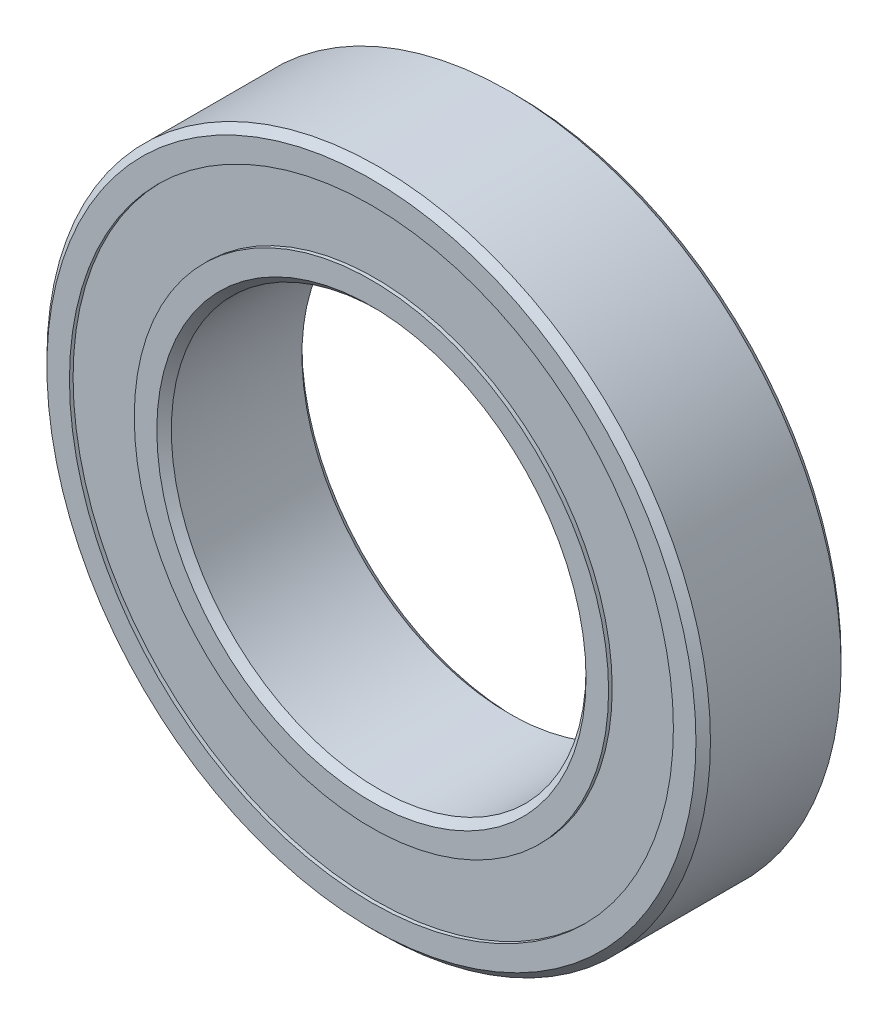
ISO-10303-21;
HEADER;
FILE_DESCRIPTION(('STEP AP214'),'2;1');
FILE_NAME('part.step','',(''),(''),'','','');
FILE_SCHEMA(('AUTOMOTIVE_DESIGN { 1 0 10303 214 1 1 1 1 }'));
ENDSEC;
DATA;
#1=APPLICATION_CONTEXT('core data for automotive mechanical design processes');
#2=APPLICATION_PROTOCOL_DEFINITION('international standard','automotive_design',2000,#1);
#3=PRODUCT_CONTEXT('',#1,'mechanical');
#4=PRODUCT('Part','Part','',(#3));
#5=PRODUCT_RELATED_PRODUCT_CATEGORY('part','',(#4));
#6=PRODUCT_DEFINITION_FORMATION('','',#4);
#7=PRODUCT_DEFINITION_CONTEXT('part definition',#1,'design');
#8=PRODUCT_DEFINITION('design','',#6,#7);
#9=PRODUCT_DEFINITION_SHAPE('','',#8);
#10=(LENGTH_UNIT() NAMED_UNIT(*) SI_UNIT(.MILLI.,.METRE.));
#11=(NAMED_UNIT(*) PLANE_ANGLE_UNIT() SI_UNIT($,.RADIAN.));
#12=(NAMED_UNIT(*) SI_UNIT($,.STERADIAN.) SOLID_ANGLE_UNIT());
#13=UNCERTAINTY_MEASURE_WITH_UNIT(LENGTH_MEASURE(1.E-05),#10,'distance_accuracy_value','');
#14=(GEOMETRIC_REPRESENTATION_CONTEXT(3) GLOBAL_UNCERTAINTY_ASSIGNED_CONTEXT((#13)) GLOBAL_UNIT_ASSIGNED_CONTEXT((#10,
#11,#12)) REPRESENTATION_CONTEXT('',''));
#15=CARTESIAN_POINT('',(0.,0.,0.));
#16=DIRECTION('',(0.,0.,1.));
#17=DIRECTION('',(1.,0.,0.));
#18=AXIS2_PLACEMENT_3D('',#15,#16,#17);
#19=CARTESIAN_POINT('',(0.,14.5625,-3.325));
#20=DIRECTION('',(0.,0.,1.));
#21=DIRECTION('',(1.,0.,0.));
#22=AXIS2_PLACEMENT_3D('',#19,#20,#21);
#23=PLANE('',#22);
#24=CARTESIAN_POINT('',(0.,0.,-3.325));
#25=DIRECTION('',(0.,0.,1.));
#26=DIRECTION('',(1.,0.,0.));
#27=AXIS2_PLACEMENT_3D('',#24,#25,#26);
#28=CIRCLE('',#27,14.5625);
#29=CARTESIAN_POINT('',(14.5625,0.,-3.325));
#30=VERTEX_POINT('',#29);
#31=EDGE_CURVE('E67',#30,#30,#28,.T.);
#32=ORIENTED_EDGE('',*,*,#31,.F.);
#33=EDGE_LOOP('',(#32));
#34=FACE_BOUND('',#33,.T.);
#35=CARTESIAN_POINT('',(0.,0.,-3.325));
#36=DIRECTION('',(0.,0.,1.));
#37=DIRECTION('',(1.,0.,0.));
#38=AXIS2_PLACEMENT_3D('',#35,#36,#37);
#39=CIRCLE('',#38,11.4375);
#40=CARTESIAN_POINT('',(11.4375,0.,-3.325));
#41=VERTEX_POINT('',#40);
#42=EDGE_CURVE('E11',#41,#41,#39,.T.);
#43=ORIENTED_EDGE('',*,*,#42,.T.);
#44=EDGE_LOOP('',(#43));
#45=FACE_BOUND('',#44,.T.);
#46=ADVANCED_FACE('F49',(#34,#45),#23,.F.);
#47=CARTESIAN_POINT('',(0.,0.,3.5));
#48=DIRECTION('',(0.,0.,1.));
#49=DIRECTION('',(1.,0.,0.));
#50=AXIS2_PLACEMENT_3D('',#47,#48,#49);
#51=CYLINDRICAL_SURFACE('',#50,11.4375);
#52=ORIENTED_EDGE('',*,*,#42,.F.);
#53=EDGE_LOOP('',(#52));
#54=FACE_BOUND('',#53,.T.);
#55=CARTESIAN_POINT('',(0.,0.,-2.20480369566539));
#56=DIRECTION('',(0.,0.,1.));
#57=DIRECTION('',(1.,0.,0.));
#58=AXIS2_PLACEMENT_3D('',#55,#56,#57);
#59=CIRCLE('',#58,11.4375);
#60=CARTESIAN_POINT('',(11.4375,0.,-2.20480369566539));
#61=VERTEX_POINT('',#60);
#62=EDGE_CURVE('E60',#61,#61,#59,.T.);
#63=ORIENTED_EDGE('',*,*,#62,.T.);
#64=EDGE_LOOP('',(#63));
#65=FACE_BOUND('',#64,.T.);
#66=ADVANCED_FACE('F78',(#54,#65),#51,.F.);
#67=CARTESIAN_POINT('',(0.,14.5625,-2.20480369566539));
#68=DIRECTION('',(0.,0.,-1.));
#69=DIRECTION('',(-1.,0.,0.));
#70=AXIS2_PLACEMENT_3D('',#67,#68,#69);
#71=PLANE('',#70);
#72=ORIENTED_EDGE('',*,*,#62,.F.);
#73=EDGE_LOOP('',(#72));
#74=FACE_BOUND('',#73,.T.);
#75=CARTESIAN_POINT('',(0.,0.,-2.20480369566539));
#76=DIRECTION('',(0.,0.,1.));
#77=DIRECTION('',(1.,0.,0.));
#78=AXIS2_PLACEMENT_3D('',#75,#76,#77);
#79=CIRCLE('',#78,14.5625);
#80=CARTESIAN_POINT('',(14.5625,0.,-2.20480369566539));
#81=VERTEX_POINT('',#80);
#82=EDGE_CURVE('E61',#81,#81,#79,.T.);
#83=ORIENTED_EDGE('',*,*,#82,.T.);
#84=EDGE_LOOP('',(#83));
#85=FACE_BOUND('',#84,.T.);
#86=ADVANCED_FACE('F84',(#74,#85),#71,.F.);
#87=CARTESIAN_POINT('',(0.,0.,3.5));
#88=DIRECTION('',(0.,0.,1.));
#89=DIRECTION('',(1.,0.,0.));
#90=AXIS2_PLACEMENT_3D('',#87,#88,#89);
#91=CYLINDRICAL_SURFACE('',#90,14.5625);
#92=ORIENTED_EDGE('',*,*,#82,.F.);
#93=EDGE_LOOP('',(#92));
#94=FACE_BOUND('',#93,.T.);
#95=ORIENTED_EDGE('',*,*,#31,.T.);
#96=EDGE_LOOP('',(#95));
#97=FACE_BOUND('',#96,.T.);
#98=ADVANCED_FACE('F79',(#94,#97),#91,.T.);
#99=CLOSED_SHELL('',(#46,#66,#86,#98));
#100=MANIFOLD_SOLID_BREP('B2',#99);
#101=CARTESIAN_POINT('',(0.,14.5625,3.325));
#102=DIRECTION('',(0.,0.,-1.));
#103=DIRECTION('',(-1.,0.,0.));
#104=AXIS2_PLACEMENT_3D('',#101,#102,#103);
#105=PLANE('',#104);
#106=CARTESIAN_POINT('',(0.,0.,3.325));
#107=DIRECTION('',(0.,0.,1.));
#108=DIRECTION('',(1.,0.,0.));
#109=AXIS2_PLACEMENT_3D('',#106,#107,#108);
#110=CIRCLE('',#109,11.4375);
#111=CARTESIAN_POINT('',(11.4375,0.,3.325));
#112=VERTEX_POINT('',#111);
#113=EDGE_CURVE('E47',#112,#112,#110,.T.);
#114=ORIENTED_EDGE('',*,*,#113,.F.);
#115=EDGE_LOOP('',(#114));
#116=FACE_BOUND('',#115,.T.);
#117=CARTESIAN_POINT('',(0.,0.,3.325));
#118=DIRECTION('',(0.,0.,1.));
#119=DIRECTION('',(1.,0.,0.));
#120=AXIS2_PLACEMENT_3D('',#117,#118,#119);
#121=CIRCLE('',#120,14.5625);
#122=CARTESIAN_POINT('',(14.5625,0.,3.325));
#123=VERTEX_POINT('',#122);
#124=EDGE_CURVE('E150',#123,#123,#121,.T.);
#125=ORIENTED_EDGE('',*,*,#124,.T.);
#126=EDGE_LOOP('',(#125));
#127=FACE_BOUND('',#126,.T.);
#128=ADVANCED_FACE('F126',(#116,#127),#105,.F.);
#129=CARTESIAN_POINT('',(0.,0.,3.5));
#130=DIRECTION('',(0.,0.,1.));
#131=DIRECTION('',(1.,0.,0.));
#132=AXIS2_PLACEMENT_3D('',#129,#130,#131);
#133=CYLINDRICAL_SURFACE('',#132,11.4375);
#134=CARTESIAN_POINT('',(0.,0.,2.20480369566539));
#135=DIRECTION('',(0.,0.,1.));
#136=DIRECTION('',(1.,0.,0.));
#137=AXIS2_PLACEMENT_3D('',#134,#135,#136);
#138=CIRCLE('',#137,11.4375);
#139=CARTESIAN_POINT('',(11.4375,0.,2.20480369566539));
#140=VERTEX_POINT('',#139);
#141=EDGE_CURVE('E133',#140,#140,#138,.T.);
#142=ORIENTED_EDGE('',*,*,#141,.F.);
#143=EDGE_LOOP('',(#142));
#144=FACE_BOUND('',#143,.T.);
#145=ORIENTED_EDGE('',*,*,#113,.T.);
#146=EDGE_LOOP('',(#145));
#147=FACE_BOUND('',#146,.T.);
#148=ADVANCED_FACE('F163',(#144,#147),#133,.F.);
#149=CARTESIAN_POINT('',(0.,14.5625,2.20480369566539));
#150=DIRECTION('',(0.,0.,1.));
#151=DIRECTION('',(1.,0.,0.));
#152=AXIS2_PLACEMENT_3D('',#149,#150,#151);
#153=PLANE('',#152);
#154=CARTESIAN_POINT('',(0.,0.,2.20480369566539));
#155=DIRECTION('',(0.,0.,1.));
#156=DIRECTION('',(1.,0.,0.));
#157=AXIS2_PLACEMENT_3D('',#154,#155,#156);
#158=CIRCLE('',#157,14.5625);
#159=CARTESIAN_POINT('',(14.5625,0.,2.20480369566539));
#160=VERTEX_POINT('',#159);
#161=EDGE_CURVE('E143',#160,#160,#158,.T.);
#162=ORIENTED_EDGE('',*,*,#161,.F.);
#163=EDGE_LOOP('',(#162));
#164=FACE_BOUND('',#163,.T.);
#165=ORIENTED_EDGE('',*,*,#141,.T.);
#166=EDGE_LOOP('',(#165));
#167=FACE_BOUND('',#166,.T.);
#168=ADVANCED_FACE('F157',(#164,#167),#153,.F.);
#169=CARTESIAN_POINT('',(0.,0.,3.5));
#170=DIRECTION('',(0.,0.,1.));
#171=DIRECTION('',(1.,0.,0.));
#172=AXIS2_PLACEMENT_3D('',#169,#170,#171);
#173=CYLINDRICAL_SURFACE('',#172,14.5625);
#174=ORIENTED_EDGE('',*,*,#124,.F.);
#175=EDGE_LOOP('',(#174));
#176=FACE_BOUND('',#175,.T.);
#177=ORIENTED_EDGE('',*,*,#161,.T.);
#178=EDGE_LOOP('',(#177));
#179=FACE_BOUND('',#178,.T.);
#180=ADVANCED_FACE('F156',(#176,#179),#173,.T.);
#181=CLOSED_SHELL('',(#128,#148,#168,#180));
#182=MANIFOLD_SOLID_BREP('B6',#181);
#183=CARTESIAN_POINT('',(-7.02833062692262,10.9362959268054,0.));
#184=DIRECTION('',(0.,0.,1.));
#185=DIRECTION('',(-0.540640817455586,0.841253532831188,0.));
#186=AXIS2_PLACEMENT_3D('',#183,#184,#185);
#187=SPHERICAL_SURFACE('',#186,2.20480369566539);
#188=CARTESIAN_POINT('',(-7.02833062692262,10.9362959268054,2.20480369566539));
#189=VERTEX_POINT('',#188);
#190=VERTEX_LOOP('',#189);
#191=FACE_BOUND('',#190,.T.);
#192=ADVANCED_FACE('F206',(#191),#187,.T.);
#193=CLOSED_SHELL('',(#192));
#194=MANIFOLD_SOLID_BREP('B42',#193);
#195=CARTESIAN_POINT('',(-11.8252159396087,5.40039516902467,0.));
#196=DIRECTION('',(0.,0.,1.));
#197=DIRECTION('',(-0.909631995354513,0.415415013001897,0.));
#198=AXIS2_PLACEMENT_3D('',#195,#196,#197);
#199=SPHERICAL_SURFACE('',#198,2.20480369566539);
#200=CARTESIAN_POINT('',(-11.8252159396087,5.40039516902467,2.20480369566539));
#201=VERTEX_POINT('',#200);
#202=VERTEX_LOOP('',#201);
#203=FACE_BOUND('',#202,.T.);
#204=ADVANCED_FACE('F223',(#203),#199,.T.);
#205=CLOSED_SHELL('',(#204));
#206=MANIFOLD_SOLID_BREP('B122',#205);
#207=CARTESIAN_POINT('',(-12.8676787444521,-1.85009289755257,0.));
#208=DIRECTION('',(0.,0.,1.));
#209=DIRECTION('',(-0.989821441880934,-0.142314838273275,0.));
#210=AXIS2_PLACEMENT_3D('',#207,#208,#209);
#211=SPHERICAL_SURFACE('',#210,2.20480369566539);
#212=CARTESIAN_POINT('',(-12.8676787444521,-1.85009289755257,2.20480369566539));
#213=VERTEX_POINT('',#212);
#214=VERTEX_LOOP('',#213);
#215=FACE_BOUND('',#214,.T.);
#216=ADVANCED_FACE('F241',(#215),#211,.T.);
#217=CLOSED_SHELL('',(#216));
#218=MANIFOLD_SOLID_BREP('B205',#217);
#219=CARTESIAN_POINT('',(-9.82474446660544,-8.51318954128862,0.));
#220=DIRECTION('',(0.,0.,1.));
#221=DIRECTION('',(-0.755749574354264,-0.654860733945278,0.));
#222=AXIS2_PLACEMENT_3D('',#219,#220,#221);
#223=SPHERICAL_SURFACE('',#222,2.20480369566539);
#224=CARTESIAN_POINT('',(-9.82474446660544,-8.51318954128862,2.20480369566539));
#225=VERTEX_POINT('',#224);
#226=VERTEX_LOOP('',#225);
#227=FACE_BOUND('',#226,.T.);
#228=ADVANCED_FACE('F263',(#227),#223,.T.);
#229=CLOSED_SHELL('',(#228));
#230=MANIFOLD_SOLID_BREP('B222',#229);
#231=CARTESIAN_POINT('',(-3.66252323893868,-12.4734086569884,0.));
#232=DIRECTION('',(0.,0.,1.));
#233=DIRECTION('',(-0.281732556841437,-0.959492973614495,0.));
#234=AXIS2_PLACEMENT_3D('',#231,#232,#233);
#235=SPHERICAL_SURFACE('',#234,2.20480369566539);
#236=CARTESIAN_POINT('',(-3.66252323893868,-12.4734086569884,2.20480369566539));
#237=VERTEX_POINT('',#236);
#238=VERTEX_LOOP('',#237);
#239=FACE_BOUND('',#238,.T.);
#240=ADVANCED_FACE('F285',(#239),#235,.T.);
#241=CLOSED_SHELL('',(#240));
#242=MANIFOLD_SOLID_BREP('B238',#241);
#243=CARTESIAN_POINT('',(3.6625232389385,-12.4734086569885,0.));
#244=DIRECTION('',(0.,0.,1.));
#245=DIRECTION('',(0.281732556841423,-0.959492973614499,0.));
#246=AXIS2_PLACEMENT_3D('',#243,#244,#245);
#247=SPHERICAL_SURFACE('',#246,2.20480369566539);
#248=CARTESIAN_POINT('',(3.6625232389385,-12.4734086569885,2.20480369566539));
#249=VERTEX_POINT('',#248);
#250=VERTEX_LOOP('',#249);
#251=FACE_BOUND('',#250,.T.);
#252=ADVANCED_FACE('F302',(#251),#247,.T.);
#253=CLOSED_SHELL('',(#252));
#254=MANIFOLD_SOLID_BREP('B259',#253);
#255=CARTESIAN_POINT('',(9.82474446660532,-8.51318954128876,0.));
#256=DIRECTION('',(0.,0.,1.));
#257=DIRECTION('',(0.755749574354255,-0.654860733945289,0.));
#258=AXIS2_PLACEMENT_3D('',#255,#256,#257);
#259=SPHERICAL_SURFACE('',#258,2.20480369566539);
#260=CARTESIAN_POINT('',(9.82474446660532,-8.51318954128876,2.20480369566539));
#261=VERTEX_POINT('',#260);
#262=VERTEX_LOOP('',#261);
#263=FACE_BOUND('',#262,.T.);
#264=ADVANCED_FACE('F319',(#263),#259,.T.);
#265=CLOSED_SHELL('',(#264));
#266=MANIFOLD_SOLID_BREP('B279',#265);
#267=CARTESIAN_POINT('',(12.8676787444521,-1.85009289755276,0.));
#268=DIRECTION('',(0.,0.,1.));
#269=DIRECTION('',(0.989821441880932,-0.142314838273289,0.));
#270=AXIS2_PLACEMENT_3D('',#267,#268,#269);
#271=SPHERICAL_SURFACE('',#270,2.20480369566539);
#272=CARTESIAN_POINT('',(12.8676787444521,-1.85009289755276,2.20480369566539));
#273=VERTEX_POINT('',#272);
#274=VERTEX_LOOP('',#273);
#275=FACE_BOUND('',#274,.T.);
#276=ADVANCED_FACE('F337',(#275),#271,.T.);
#277=CLOSED_SHELL('',(#276));
#278=MANIFOLD_SOLID_BREP('B299',#277);
#279=CARTESIAN_POINT('',(11.8252159396088,5.40039516902449,0.));
#280=DIRECTION('',(0.,0.,1.));
#281=DIRECTION('',(0.909631995354519,0.415415013001884,0.));
#282=AXIS2_PLACEMENT_3D('',#279,#280,#281);
#283=SPHERICAL_SURFACE('',#282,2.20480369566539);
#284=CARTESIAN_POINT('',(11.8252159396088,5.40039516902449,2.20480369566539));
#285=VERTEX_POINT('',#284);
#286=VERTEX_LOOP('',#285);
#287=FACE_BOUND('',#286,.T.);
#288=ADVANCED_FACE('F358',(#287),#283,.T.);
#289=CLOSED_SHELL('',(#288));
#290=MANIFOLD_SOLID_BREP('B316',#289);
#291=CARTESIAN_POINT('',(7.02833062692278,10.9362959268054,0.));
#292=DIRECTION('',(0.,0.,1.));
#293=DIRECTION('',(0.540640817455599,0.841253532831181,0.));
#294=AXIS2_PLACEMENT_3D('',#291,#292,#293);
#295=SPHERICAL_SURFACE('',#294,2.20480369566539);
#296=CARTESIAN_POINT('',(7.02833062692278,10.9362959268054,2.20480369566539));
#297=VERTEX_POINT('',#296);
#298=VERTEX_LOOP('',#297);
#299=FACE_BOUND('',#298,.T.);
#300=ADVANCED_FACE('F380',(#299),#295,.T.);
#301=CLOSED_SHELL('',(#300));
#302=MANIFOLD_SOLID_BREP('B333',#301);
#303=CARTESIAN_POINT('',(0.,13.,0.));
#304=DIRECTION('',(0.,0.,1.));
#305=DIRECTION('',(0.,1.,0.));
#306=AXIS2_PLACEMENT_3D('',#303,#304,#305);
#307=SPHERICAL_SURFACE('',#306,2.20480369566539);
#308=CARTESIAN_POINT('',(0.,13.,2.20480369566539));
#309=VERTEX_POINT('',#308);
#310=VERTEX_LOOP('',#309);
#311=FACE_BOUND('',#310,.T.);
#312=ADVANCED_FACE('F398',(#311),#307,.T.);
#313=CLOSED_SHELL('',(#312));
#314=MANIFOLD_SOLID_BREP('B351',#313);
#315=CARTESIAN_POINT('',(0.,0.,3.5));
#316=DIRECTION('',(0.,0.,1.));
#317=DIRECTION('',(1.,0.,0.));
#318=AXIS2_PLACEMENT_3D('',#315,#316,#317);
#319=CONICAL_SURFACE('',#318,10.35,0.78539816339745);
#320=CARTESIAN_POINT('',(0.,0.,3.15));
#321=DIRECTION('',(0.,0.,1.));
#322=DIRECTION('',(1.,0.,0.));
#323=AXIS2_PLACEMENT_3D('',#320,#321,#322);
#324=CIRCLE('',#323,10.);
#325=CARTESIAN_POINT('',(10.,0.,3.15));
#326=VERTEX_POINT('',#325);
#327=EDGE_CURVE('E400',#326,#326,#324,.T.);
#328=ORIENTED_EDGE('',*,*,#327,.F.);
#329=EDGE_LOOP('',(#328));
#330=FACE_BOUND('',#329,.T.);
#331=CARTESIAN_POINT('',(0.,0.,3.5));
#332=DIRECTION('',(0.,0.,1.));
#333=DIRECTION('',(1.,0.,0.));
#334=AXIS2_PLACEMENT_3D('',#331,#332,#333);
#335=CIRCLE('',#334,10.35);
#336=CARTESIAN_POINT('',(10.35,0.,3.5));
#337=VERTEX_POINT('',#336);
#338=EDGE_CURVE('E454',#337,#337,#335,.T.);
#339=ORIENTED_EDGE('',*,*,#338,.T.);
#340=EDGE_LOOP('',(#339));
#341=FACE_BOUND('',#340,.T.);
#342=ADVANCED_FACE('F416',(#330,#341),#319,.F.);
#343=CARTESIAN_POINT('',(0.,0.,3.5));
#344=DIRECTION('',(0.,0.,1.));
#345=DIRECTION('',(1.,0.,0.));
#346=AXIS2_PLACEMENT_3D('',#343,#344,#345);
#347=CYLINDRICAL_SURFACE('',#346,10.);
#348=CARTESIAN_POINT('',(0.,0.,-3.15));
#349=DIRECTION('',(0.,0.,1.));
#350=DIRECTION('',(1.,0.,0.));
#351=AXIS2_PLACEMENT_3D('',#348,#349,#350);
#352=CIRCLE('',#351,10.);
#353=CARTESIAN_POINT('',(10.,0.,-3.15));
#354=VERTEX_POINT('',#353);
#355=EDGE_CURVE('E422',#354,#354,#352,.T.);
#356=ORIENTED_EDGE('',*,*,#355,.F.);
#357=EDGE_LOOP('',(#356));
#358=FACE_BOUND('',#357,.T.);
#359=ORIENTED_EDGE('',*,*,#327,.T.);
#360=EDGE_LOOP('',(#359));
#361=FACE_BOUND('',#360,.T.);
#362=ADVANCED_FACE('F493',(#358,#361),#347,.F.);
#363=CARTESIAN_POINT('',(0.,0.,-3.15));
#364=DIRECTION('',(0.,0.,-1.));
#365=DIRECTION('',(-1.,0.,0.));
#366=AXIS2_PLACEMENT_3D('',#363,#364,#365);
#367=CONICAL_SURFACE('',#366,10.,0.785398163397451);
#368=CARTESIAN_POINT('',(0.,0.,-3.5));
#369=DIRECTION('',(0.,0.,1.));
#370=DIRECTION('',(1.,0.,0.));
#371=AXIS2_PLACEMENT_3D('',#368,#369,#370);
#372=CIRCLE('',#371,10.35);
#373=CARTESIAN_POINT('',(10.35,0.,-3.5));
#374=VERTEX_POINT('',#373);
#375=EDGE_CURVE('E431',#374,#374,#372,.T.);
#376=ORIENTED_EDGE('',*,*,#375,.F.);
#377=EDGE_LOOP('',(#376));
#378=FACE_BOUND('',#377,.T.);
#379=ORIENTED_EDGE('',*,*,#355,.T.);
#380=EDGE_LOOP('',(#379));
#381=FACE_BOUND('',#380,.T.);
#382=ADVANCED_FACE('F487',(#378,#381),#367,.F.);
#383=CARTESIAN_POINT('',(0.,10.35,-3.5));
#384=DIRECTION('',(0.,0.,1.));
#385=DIRECTION('',(1.,0.,0.));
#386=AXIS2_PLACEMENT_3D('',#383,#384,#385);
#387=PLANE('',#386);
#388=CARTESIAN_POINT('',(0.,0.,-3.5));
#389=DIRECTION('',(0.,0.,1.));
#390=DIRECTION('',(1.,0.,0.));
#391=AXIS2_PLACEMENT_3D('',#388,#389,#390);
#392=CIRCLE('',#391,11.4375);
#393=CARTESIAN_POINT('',(11.4375,0.,-3.5));
#394=VERTEX_POINT('',#393);
#395=EDGE_CURVE('E440',#394,#394,#392,.T.);
#396=ORIENTED_EDGE('',*,*,#395,.F.);
#397=EDGE_LOOP('',(#396));
#398=FACE_BOUND('',#397,.T.);
#399=ORIENTED_EDGE('',*,*,#375,.T.);
#400=EDGE_LOOP('',(#399));
#401=FACE_BOUND('',#400,.T.);
#402=ADVANCED_FACE('F483',(#398,#401),#387,.F.);
#403=CARTESIAN_POINT('',(0.,0.,3.5));
#404=DIRECTION('',(0.,0.,1.));
#405=DIRECTION('',(1.,0.,0.));
#406=AXIS2_PLACEMENT_3D('',#403,#404,#405);
#407=CYLINDRICAL_SURFACE('',#406,11.4375);
#408=CARTESIAN_POINT('',(0.,0.,-1.55555555555555));
#409=DIRECTION('',(0.,0.,1.));
#410=DIRECTION('',(1.,0.,0.));
#411=AXIS2_PLACEMENT_3D('',#408,#409,#410);
#412=CIRCLE('',#411,11.4375);
#413=CARTESIAN_POINT('',(11.4375,0.,-1.55555555555555));
#414=VERTEX_POINT('',#413);
#415=EDGE_CURVE('E444',#414,#414,#412,.T.);
#416=ORIENTED_EDGE('',*,*,#415,.F.);
#417=EDGE_LOOP('',(#416));
#418=FACE_BOUND('',#417,.T.);
#419=ORIENTED_EDGE('',*,*,#395,.T.);
#420=EDGE_LOOP('',(#419));
#421=FACE_BOUND('',#420,.T.);
#422=ADVANCED_FACE('F480',(#418,#421),#407,.T.);
#423=CARTESIAN_POINT('',(0.,0.,0.));
#424=DIRECTION('',(0.,0.,1.));
#425=DIRECTION('',(1.,0.,0.));
#426=AXIS2_PLACEMENT_3D('',#423,#424,#425);
#427=TOROIDAL_SURFACE('',#426,13.,2.20480369566539);
#428=CARTESIAN_POINT('',(0.,0.,1.55555555555556));
#429=DIRECTION('',(0.,0.,1.));
#430=DIRECTION('',(1.,0.,0.));
#431=AXIS2_PLACEMENT_3D('',#428,#429,#430);
#432=CIRCLE('',#431,11.4375);
#433=CARTESIAN_POINT('',(11.4375,0.,1.55555555555556));
#434=VERTEX_POINT('',#433);
#435=EDGE_CURVE('E450',#434,#434,#432,.T.);
#436=ORIENTED_EDGE('',*,*,#435,.F.);
#437=EDGE_LOOP('',(#436));
#438=FACE_BOUND('',#437,.T.);
#439=ORIENTED_EDGE('',*,*,#415,.T.);
#440=EDGE_LOOP('',(#439));
#441=FACE_BOUND('',#440,.T.);
#442=ADVANCED_FACE('F473',(#438,#441),#427,.F.);
#443=CARTESIAN_POINT('',(0.,0.,3.5));
#444=DIRECTION('',(0.,0.,1.));
#445=DIRECTION('',(1.,0.,0.));
#446=AXIS2_PLACEMENT_3D('',#443,#444,#445);
#447=CYLINDRICAL_SURFACE('',#446,11.4375);
#448=CARTESIAN_POINT('',(0.,0.,3.5));
#449=DIRECTION('',(0.,0.,1.));
#450=DIRECTION('',(1.,0.,0.));
#451=AXIS2_PLACEMENT_3D('',#448,#449,#450);
#452=CIRCLE('',#451,11.4375);
#453=CARTESIAN_POINT('',(11.4375,0.,3.5));
#454=VERTEX_POINT('',#453);
#455=EDGE_CURVE('E451',#454,#454,#452,.T.);
#456=ORIENTED_EDGE('',*,*,#455,.F.);
#457=EDGE_LOOP('',(#456));
#458=FACE_BOUND('',#457,.T.);
#459=ORIENTED_EDGE('',*,*,#435,.T.);
#460=EDGE_LOOP('',(#459));
#461=FACE_BOUND('',#460,.T.);
#462=ADVANCED_FACE('F463',(#458,#461),#447,.T.);
#463=CARTESIAN_POINT('',(0.,10.35,3.5));
#464=DIRECTION('',(0.,0.,-1.));
#465=DIRECTION('',(-1.,0.,0.));
#466=AXIS2_PLACEMENT_3D('',#463,#464,#465);
#467=PLANE('',#466);
#468=ORIENTED_EDGE('',*,*,#338,.F.);
#469=EDGE_LOOP('',(#468));
#470=FACE_BOUND('',#469,.T.);
#471=ORIENTED_EDGE('',*,*,#455,.T.);
#472=EDGE_LOOP('',(#471));
#473=FACE_BOUND('',#472,.T.);
#474=ADVANCED_FACE('F464',(#470,#473),#467,.F.);
#475=CLOSED_SHELL('',(#342,#362,#382,#402,#422,#442,#462,#474));
#476=MANIFOLD_SOLID_BREP('B373',#475);
#477=CARTESIAN_POINT('',(0.,0.,3.15));
#478=DIRECTION('',(0.,0.,-1.));
#479=DIRECTION('',(-1.,0.,0.));
#480=AXIS2_PLACEMENT_3D('',#477,#478,#479);
#481=CONICAL_SURFACE('',#480,16.,0.785398163397449);
#482=CARTESIAN_POINT('',(0.,0.,3.5));
#483=DIRECTION('',(0.,0.,1.));
#484=DIRECTION('',(1.,0.,0.));
#485=AXIS2_PLACEMENT_3D('',#482,#483,#484);
#486=CIRCLE('',#485,15.65);
#487=CARTESIAN_POINT('',(15.65,0.,3.5));
#488=VERTEX_POINT('',#487);
#489=EDGE_CURVE('E417',#488,#488,#486,.T.);
#490=ORIENTED_EDGE('',*,*,#489,.F.);
#491=EDGE_LOOP('',(#490));
#492=FACE_BOUND('',#491,.T.);
#493=CARTESIAN_POINT('',(0.,0.,3.15));
#494=DIRECTION('',(0.,0.,1.));
#495=DIRECTION('',(1.,0.,0.));
#496=AXIS2_PLACEMENT_3D('',#493,#494,#495);
#497=CIRCLE('',#496,16.);
#498=CARTESIAN_POINT('',(16.,0.,3.15));
#499=VERTEX_POINT('',#498);
#500=EDGE_CURVE('E593',#499,#499,#497,.T.);
#501=ORIENTED_EDGE('',*,*,#500,.T.);
#502=EDGE_LOOP('',(#501));
#503=FACE_BOUND('',#502,.T.);
#504=ADVANCED_FACE('F558',(#492,#503),#481,.T.);
#505=CARTESIAN_POINT('',(0.,15.65,3.5));
#506=DIRECTION('',(0.,0.,-1.));
#507=DIRECTION('',(-1.,0.,0.));
#508=AXIS2_PLACEMENT_3D('',#505,#506,#507);
#509=PLANE('',#508);
#510=CARTESIAN_POINT('',(0.,0.,3.5));
#511=DIRECTION('',(0.,0.,1.));
#512=DIRECTION('',(1.,0.,0.));
#513=AXIS2_PLACEMENT_3D('',#510,#511,#512);
#514=CIRCLE('',#513,14.5625);
#515=CARTESIAN_POINT('',(14.5625,0.,3.5));
#516=VERTEX_POINT('',#515);
#517=EDGE_CURVE('E563',#516,#516,#514,.T.);
#518=ORIENTED_EDGE('',*,*,#517,.F.);
#519=EDGE_LOOP('',(#518));
#520=FACE_BOUND('',#519,.T.);
#521=ORIENTED_EDGE('',*,*,#489,.T.);
#522=EDGE_LOOP('',(#521));
#523=FACE_BOUND('',#522,.T.);
#524=ADVANCED_FACE('F635',(#520,#523),#509,.F.);
#525=CARTESIAN_POINT('',(0.,0.,3.5));
#526=DIRECTION('',(0.,0.,1.));
#527=DIRECTION('',(1.,0.,0.));
#528=AXIS2_PLACEMENT_3D('',#525,#526,#527);
#529=CYLINDRICAL_SURFACE('',#528,14.5625);
#530=CARTESIAN_POINT('',(0.,0.,1.55555555555556));
#531=DIRECTION('',(0.,0.,1.));
#532=DIRECTION('',(1.,0.,0.));
#533=AXIS2_PLACEMENT_3D('',#530,#531,#532);
#534=CIRCLE('',#533,14.5625);
#535=CARTESIAN_POINT('',(14.5625,0.,1.55555555555556));
#536=VERTEX_POINT('',#535);
#537=EDGE_CURVE('E569',#536,#536,#534,.T.);
#538=ORIENTED_EDGE('',*,*,#537,.F.);
#539=EDGE_LOOP('',(#538));
#540=FACE_BOUND('',#539,.T.);
#541=ORIENTED_EDGE('',*,*,#517,.T.);
#542=EDGE_LOOP('',(#541));
#543=FACE_BOUND('',#542,.T.);
#544=ADVANCED_FACE('F629',(#540,#543),#529,.F.);
#545=CARTESIAN_POINT('',(0.,0.,0.));
#546=DIRECTION('',(0.,0.,1.));
#547=DIRECTION('',(1.,0.,0.));
#548=AXIS2_PLACEMENT_3D('',#545,#546,#547);
#549=TOROIDAL_SURFACE('',#548,13.,2.20480369566539);
#550=CARTESIAN_POINT('',(0.,0.,-1.55555555555556));
#551=DIRECTION('',(0.,0.,1.));
#552=DIRECTION('',(1.,0.,0.));
#553=AXIS2_PLACEMENT_3D('',#550,#551,#552);
#554=CIRCLE('',#553,14.5625);
#555=CARTESIAN_POINT('',(14.5625,0.,-1.55555555555556));
#556=VERTEX_POINT('',#555);
#557=EDGE_CURVE('E573',#556,#556,#554,.T.);
#558=ORIENTED_EDGE('',*,*,#557,.F.);
#559=EDGE_LOOP('',(#558));
#560=FACE_BOUND('',#559,.T.);
#561=ORIENTED_EDGE('',*,*,#537,.T.);
#562=EDGE_LOOP('',(#561));
#563=FACE_BOUND('',#562,.T.);
#564=ADVANCED_FACE('F622',(#560,#563),#549,.F.);
#565=CARTESIAN_POINT('',(0.,0.,3.5));
#566=DIRECTION('',(0.,0.,1.));
#567=DIRECTION('',(1.,0.,0.));
#568=AXIS2_PLACEMENT_3D('',#565,#566,#567);
#569=CYLINDRICAL_SURFACE('',#568,14.5625);
#570=CARTESIAN_POINT('',(0.,0.,-3.5));
#571=DIRECTION('',(0.,0.,1.));
#572=DIRECTION('',(1.,0.,0.));
#573=AXIS2_PLACEMENT_3D('',#570,#571,#572);
#574=CIRCLE('',#573,14.5625);
#575=CARTESIAN_POINT('',(14.5625,0.,-3.5));
#576=VERTEX_POINT('',#575);
#577=EDGE_CURVE('E583',#576,#576,#574,.T.);
#578=ORIENTED_EDGE('',*,*,#577,.F.);
#579=EDGE_LOOP('',(#578));
#580=FACE_BOUND('',#579,.T.);
#581=ORIENTED_EDGE('',*,*,#557,.T.);
#582=EDGE_LOOP('',(#581));
#583=FACE_BOUND('',#582,.T.);
#584=ADVANCED_FACE('F614',(#580,#583),#569,.F.);
#585=CARTESIAN_POINT('',(0.,15.65,-3.5));
#586=DIRECTION('',(0.,0.,1.));
#587=DIRECTION('',(1.,0.,0.));
#588=AXIS2_PLACEMENT_3D('',#585,#586,#587);
#589=PLANE('',#588);
#590=CARTESIAN_POINT('',(0.,0.,-3.5));
#591=DIRECTION('',(0.,0.,1.));
#592=DIRECTION('',(1.,0.,0.));
#593=AXIS2_PLACEMENT_3D('',#590,#591,#592);
#594=CIRCLE('',#593,15.65);
#595=CARTESIAN_POINT('',(15.65,0.,-3.5));
#596=VERTEX_POINT('',#595);
#597=EDGE_CURVE('E584',#596,#596,#594,.T.);
#598=ORIENTED_EDGE('',*,*,#597,.F.);
#599=EDGE_LOOP('',(#598));
#600=FACE_BOUND('',#599,.T.);
#601=ORIENTED_EDGE('',*,*,#577,.T.);
#602=EDGE_LOOP('',(#601));
#603=FACE_BOUND('',#602,.T.);
#604=ADVANCED_FACE('F606',(#600,#603),#589,.F.);
#605=CARTESIAN_POINT('',(0.,0.,-3.5));
#606=DIRECTION('',(0.,0.,1.));
#607=DIRECTION('',(1.,0.,0.));
#608=AXIS2_PLACEMENT_3D('',#605,#606,#607);
#609=CONICAL_SURFACE('',#608,15.65,0.785398163397454);
#610=CARTESIAN_POINT('',(0.,0.,-3.15));
#611=DIRECTION('',(0.,0.,1.));
#612=DIRECTION('',(1.,0.,0.));
#613=AXIS2_PLACEMENT_3D('',#610,#611,#612);
#614=CIRCLE('',#613,16.);
#615=CARTESIAN_POINT('',(16.,0.,-3.15));
#616=VERTEX_POINT('',#615);
#617=EDGE_CURVE('E589',#616,#616,#614,.T.);
#618=ORIENTED_EDGE('',*,*,#617,.F.);
#619=EDGE_LOOP('',(#618));
#620=FACE_BOUND('',#619,.T.);
#621=ORIENTED_EDGE('',*,*,#597,.T.);
#622=EDGE_LOOP('',(#621));
#623=FACE_BOUND('',#622,.T.);
#624=ADVANCED_FACE('F602',(#620,#623),#609,.T.);
#625=CARTESIAN_POINT('',(0.,0.,3.5));
#626=DIRECTION('',(0.,0.,1.));
#627=DIRECTION('',(1.,0.,0.));
#628=AXIS2_PLACEMENT_3D('',#625,#626,#627);
#629=CYLINDRICAL_SURFACE('',#628,16.);
#630=ORIENTED_EDGE('',*,*,#500,.F.);
#631=EDGE_LOOP('',(#630));
#632=FACE_BOUND('',#631,.T.);
#633=ORIENTED_EDGE('',*,*,#617,.T.);
#634=EDGE_LOOP('',(#633));
#635=FACE_BOUND('',#634,.T.);
#636=ADVANCED_FACE('F599',(#632,#635),#629,.T.);
#637=CLOSED_SHELL('',(#504,#524,#544,#564,#584,#604,#624,#636));
#638=MANIFOLD_SOLID_BREP('B395',#637);
#639=ADVANCED_BREP_SHAPE_REPRESENTATION('',(#18,#100,#182,#194,#206,#218,#230,#242,#254,#266,
#278,#290,#302,#314,#476,#638),#14);
#640=SHAPE_DEFINITION_REPRESENTATION(#9,#639);
ENDSEC;
END-ISO-10303-21;
